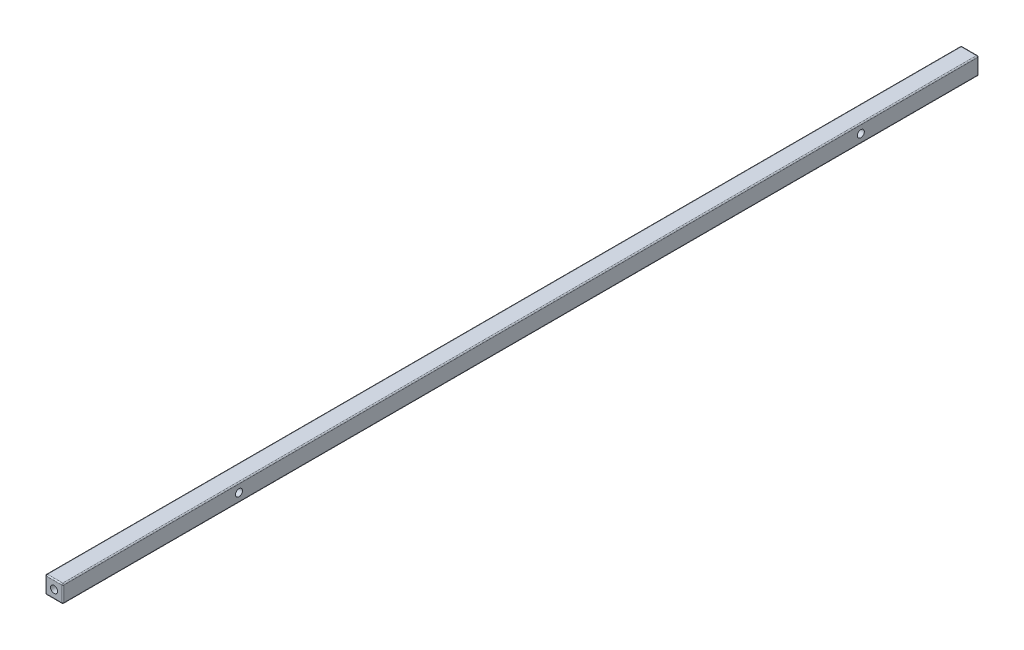
ISO-10303-21;
HEADER;
FILE_DESCRIPTION(('STEP AP214'),'2;1');
FILE_NAME('part.step','',(''),(''),'','','');
FILE_SCHEMA(('AUTOMOTIVE_DESIGN { 1 0 10303 214 1 1 1 1 }'));
ENDSEC;
DATA;
#1=APPLICATION_CONTEXT('core data for automotive mechanical design processes');
#2=APPLICATION_PROTOCOL_DEFINITION('international standard','automotive_design',2000,#1);
#3=PRODUCT_CONTEXT('',#1,'mechanical');
#4=PRODUCT('Part','Part','',(#3));
#5=PRODUCT_RELATED_PRODUCT_CATEGORY('part','',(#4));
#6=PRODUCT_DEFINITION_FORMATION('','',#4);
#7=PRODUCT_DEFINITION_CONTEXT('part definition',#1,'design');
#8=PRODUCT_DEFINITION('design','',#6,#7);
#9=PRODUCT_DEFINITION_SHAPE('','',#8);
#10=(LENGTH_UNIT() NAMED_UNIT(*) SI_UNIT(.MILLI.,.METRE.));
#11=(NAMED_UNIT(*) PLANE_ANGLE_UNIT() SI_UNIT($,.RADIAN.));
#12=(NAMED_UNIT(*) SI_UNIT($,.STERADIAN.) SOLID_ANGLE_UNIT());
#13=UNCERTAINTY_MEASURE_WITH_UNIT(LENGTH_MEASURE(1.E-05),#10,'distance_accuracy_value','');
#14=(GEOMETRIC_REPRESENTATION_CONTEXT(3) GLOBAL_UNCERTAINTY_ASSIGNED_CONTEXT((#13)) GLOBAL_UNIT_ASSIGNED_CONTEXT((#10,
#11,#12)) REPRESENTATION_CONTEXT('',''));
#15=CARTESIAN_POINT('',(0.,0.,0.));
#16=DIRECTION('',(0.,0.,1.));
#17=DIRECTION('',(1.,0.,0.));
#18=AXIS2_PLACEMENT_3D('',#15,#16,#17);
#19=CARTESIAN_POINT('',(15.,0.,785.));
#20=DIRECTION('',(-1.,0.,0.));
#21=DIRECTION('',(0.,0.,1.));
#22=AXIS2_PLACEMENT_3D('',#19,#20,#21);
#23=PLANE('',#22);
#24=CARTESIAN_POINT('',(15.,7.5,101.));
#25=DIRECTION('',(1.,0.,0.));
#26=DIRECTION('',(0.,0.,-1.));
#27=AXIS2_PLACEMENT_3D('',#24,#25,#26);
#28=CIRCLE('',#27,3.00000000000001);
#29=CARTESIAN_POINT('',(15.,7.5,98.));
#30=VERTEX_POINT('',#29);
#31=EDGE_CURVE('E488',#30,#30,#28,.T.);
#32=ORIENTED_EDGE('',*,*,#31,.F.);
#33=EDGE_LOOP('',(#32));
#34=FACE_BOUND('',#33,.T.);
#35=CARTESIAN_POINT('',(15.,7.5,634.));
#36=DIRECTION('',(1.,0.,0.));
#37=DIRECTION('',(0.,0.,-1.));
#38=AXIS2_PLACEMENT_3D('',#35,#36,#37);
#39=CIRCLE('',#38,3.00000000000005);
#40=CARTESIAN_POINT('',(15.,7.5,631.));
#41=VERTEX_POINT('',#40);
#42=EDGE_CURVE('E485',#41,#41,#39,.T.);
#43=ORIENTED_EDGE('',*,*,#42,.F.);
#44=EDGE_LOOP('',(#43));
#45=FACE_BOUND('',#44,.T.);
#46=DIRECTION('',(0.,0.,-1.));
#47=VECTOR('',#46,1.);
#48=CARTESIAN_POINT('',(15.,1.,785.));
#49=LINE('',#48,#47);
#50=CARTESIAN_POINT('',(15.,1.,784.));
#51=VERTEX_POINT('',#50);
#52=CARTESIAN_POINT('',(15.,1.,1.));
#53=VERTEX_POINT('',#52);
#54=EDGE_CURVE('E213',#51,#53,#49,.T.);
#55=ORIENTED_EDGE('',*,*,#54,.T.);
#56=DIRECTION('',(0.,1.,0.));
#57=VECTOR('',#56,1.);
#58=CARTESIAN_POINT('',(15.,0.,1.));
#59=LINE('',#58,#57);
#60=CARTESIAN_POINT('',(15.,14.,1.));
#61=VERTEX_POINT('',#60);
#62=EDGE_CURVE('E216',#53,#61,#59,.T.);
#63=ORIENTED_EDGE('',*,*,#62,.T.);
#64=DIRECTION('',(0.,0.,-1.));
#65=VECTOR('',#64,1.);
#66=CARTESIAN_POINT('',(15.,14.,785.));
#67=LINE('',#66,#65);
#68=CARTESIAN_POINT('',(15.,14.,784.));
#69=VERTEX_POINT('',#68);
#70=EDGE_CURVE('E210',#61,#69,#67,.F.);
#71=ORIENTED_EDGE('',*,*,#70,.T.);
#72=DIRECTION('',(0.,1.,0.));
#73=VECTOR('',#72,1.);
#74=CARTESIAN_POINT('',(15.,0.,784.));
#75=LINE('',#74,#73);
#76=EDGE_CURVE('E207',#69,#51,#75,.F.);
#77=ORIENTED_EDGE('',*,*,#76,.T.);
#78=EDGE_LOOP('',(#55,#63,#71,#77));
#79=FACE_BOUND('',#78,.T.);
#80=ADVANCED_FACE('F43',(#34,#45,#79),#23,.F.);
#81=CARTESIAN_POINT('',(15.,15.,785.));
#82=DIRECTION('',(0.,-1.,0.));
#83=DIRECTION('',(0.,0.,-1.));
#84=AXIS2_PLACEMENT_3D('',#81,#82,#83);
#85=PLANE('',#84);
#86=DIRECTION('',(0.,0.,-1.));
#87=VECTOR('',#86,1.);
#88=CARTESIAN_POINT('',(14.,15.,785.));
#89=LINE('',#88,#87);
#90=CARTESIAN_POINT('',(14.,15.,784.));
#91=VERTEX_POINT('',#90);
#92=CARTESIAN_POINT('',(14.,15.,1.));
#93=VERTEX_POINT('',#92);
#94=EDGE_CURVE('E226',#91,#93,#89,.T.);
#95=ORIENTED_EDGE('',*,*,#94,.T.);
#96=DIRECTION('',(-1.,0.,0.));
#97=VECTOR('',#96,1.);
#98=CARTESIAN_POINT('',(15.,15.,1.));
#99=LINE('',#98,#97);
#100=CARTESIAN_POINT('',(1.,15.,1.));
#101=VERTEX_POINT('',#100);
#102=EDGE_CURVE('E229',#93,#101,#99,.T.);
#103=ORIENTED_EDGE('',*,*,#102,.T.);
#104=DIRECTION('',(0.,0.,-1.));
#105=VECTOR('',#104,1.);
#106=CARTESIAN_POINT('',(1.,15.,785.));
#107=LINE('',#106,#105);
#108=CARTESIAN_POINT('',(1.,15.,784.));
#109=VERTEX_POINT('',#108);
#110=EDGE_CURVE('E220',#101,#109,#107,.F.);
#111=ORIENTED_EDGE('',*,*,#110,.T.);
#112=DIRECTION('',(-1.,0.,0.));
#113=VECTOR('',#112,1.);
#114=CARTESIAN_POINT('',(15.,15.,784.));
#115=LINE('',#114,#113);
#116=EDGE_CURVE('E223',#109,#91,#115,.F.);
#117=ORIENTED_EDGE('',*,*,#116,.T.);
#118=EDGE_LOOP('',(#95,#103,#111,#117));
#119=FACE_BOUND('',#118,.T.);
#120=ADVANCED_FACE('F356',(#119),#85,.F.);
#121=CARTESIAN_POINT('',(0.,15.,785.));
#122=DIRECTION('',(1.,0.,0.));
#123=DIRECTION('',(0.,0.,-1.));
#124=AXIS2_PLACEMENT_3D('',#121,#122,#123);
#125=PLANE('',#124);
#126=CARTESIAN_POINT('',(0.,7.5,101.));
#127=DIRECTION('',(1.,0.,0.));
#128=DIRECTION('',(0.,0.,-1.));
#129=AXIS2_PLACEMENT_3D('',#126,#127,#128);
#130=CIRCLE('',#129,3.00000000000001);
#131=CARTESIAN_POINT('',(0.,7.5,98.));
#132=VERTEX_POINT('',#131);
#133=EDGE_CURVE('E148',#132,#132,#130,.T.);
#134=ORIENTED_EDGE('',*,*,#133,.T.);
#135=EDGE_LOOP('',(#134));
#136=FACE_BOUND('',#135,.T.);
#137=CARTESIAN_POINT('',(0.,7.5,634.));
#138=DIRECTION('',(1.,0.,0.));
#139=DIRECTION('',(0.,0.,-1.));
#140=AXIS2_PLACEMENT_3D('',#137,#138,#139);
#141=CIRCLE('',#140,3.00000000000005);
#142=CARTESIAN_POINT('',(0.,7.5,631.));
#143=VERTEX_POINT('',#142);
#144=EDGE_CURVE('E482',#143,#143,#141,.T.);
#145=ORIENTED_EDGE('',*,*,#144,.T.);
#146=EDGE_LOOP('',(#145));
#147=FACE_BOUND('',#146,.T.);
#148=DIRECTION('',(0.,-1.,0.));
#149=VECTOR('',#148,1.);
#150=CARTESIAN_POINT('',(0.,15.,784.));
#151=LINE('',#150,#149);
#152=CARTESIAN_POINT('',(0.,1.,784.));
#153=VERTEX_POINT('',#152);
#154=CARTESIAN_POINT('',(0.,14.,784.));
#155=VERTEX_POINT('',#154);
#156=EDGE_CURVE('E169',#153,#155,#151,.F.);
#157=ORIENTED_EDGE('',*,*,#156,.T.);
#158=DIRECTION('',(0.,0.,-1.));
#159=VECTOR('',#158,1.);
#160=CARTESIAN_POINT('',(0.,14.,785.));
#161=LINE('',#160,#159);
#162=CARTESIAN_POINT('',(0.,14.,1.));
#163=VERTEX_POINT('',#162);
#164=EDGE_CURVE('E174',#155,#163,#161,.T.);
#165=ORIENTED_EDGE('',*,*,#164,.T.);
#166=DIRECTION('',(0.,-1.,0.));
#167=VECTOR('',#166,1.);
#168=CARTESIAN_POINT('',(0.,15.,1.));
#169=LINE('',#168,#167);
#170=CARTESIAN_POINT('',(0.,1.,1.));
#171=VERTEX_POINT('',#170);
#172=EDGE_CURVE('E141',#163,#171,#169,.T.);
#173=ORIENTED_EDGE('',*,*,#172,.T.);
#174=DIRECTION('',(0.,0.,-1.));
#175=VECTOR('',#174,1.);
#176=CARTESIAN_POINT('',(0.,1.,785.));
#177=LINE('',#176,#175);
#178=EDGE_CURVE('E162',#171,#153,#177,.F.);
#179=ORIENTED_EDGE('',*,*,#178,.T.);
#180=EDGE_LOOP('',(#157,#165,#173,#179));
#181=FACE_BOUND('',#180,.T.);
#182=ADVANCED_FACE('F172',(#136,#147,#181),#125,.F.);
#183=CARTESIAN_POINT('',(0.,0.,785.));
#184=DIRECTION('',(0.,1.,0.));
#185=DIRECTION('',(0.,0.,1.));
#186=AXIS2_PLACEMENT_3D('',#183,#184,#185);
#187=PLANE('',#186);
#188=DIRECTION('',(0.,0.,-1.));
#189=VECTOR('',#188,1.);
#190=CARTESIAN_POINT('',(1.,0.,785.));
#191=LINE('',#190,#189);
#192=CARTESIAN_POINT('',(1.,0.,784.));
#193=VERTEX_POINT('',#192);
#194=CARTESIAN_POINT('',(1.,0.,1.));
#195=VERTEX_POINT('',#194);
#196=EDGE_CURVE('E194',#193,#195,#191,.T.);
#197=ORIENTED_EDGE('',*,*,#196,.T.);
#198=DIRECTION('',(1.,0.,0.));
#199=VECTOR('',#198,1.);
#200=CARTESIAN_POINT('',(0.,0.,1.));
#201=LINE('',#200,#199);
#202=CARTESIAN_POINT('',(14.,0.,1.));
#203=VERTEX_POINT('',#202);
#204=EDGE_CURVE('E203',#195,#203,#201,.T.);
#205=ORIENTED_EDGE('',*,*,#204,.T.);
#206=DIRECTION('',(0.,0.,-1.));
#207=VECTOR('',#206,1.);
#208=CARTESIAN_POINT('',(14.,0.,785.));
#209=LINE('',#208,#207);
#210=CARTESIAN_POINT('',(14.,0.,784.));
#211=VERTEX_POINT('',#210);
#212=EDGE_CURVE('E200',#203,#211,#209,.F.);
#213=ORIENTED_EDGE('',*,*,#212,.T.);
#214=DIRECTION('',(1.,0.,0.));
#215=VECTOR('',#214,1.);
#216=CARTESIAN_POINT('',(0.,0.,784.));
#217=LINE('',#216,#215);
#218=EDGE_CURVE('E197',#211,#193,#217,.F.);
#219=ORIENTED_EDGE('',*,*,#218,.T.);
#220=EDGE_LOOP('',(#197,#205,#213,#219));
#221=FACE_BOUND('',#220,.T.);
#222=ADVANCED_FACE('F352',(#221),#187,.F.);
#223=CARTESIAN_POINT('',(0.,0.,785.));
#224=DIRECTION('',(0.,0.,1.));
#225=DIRECTION('',(1.,0.,0.));
#226=AXIS2_PLACEMENT_3D('',#223,#224,#225);
#227=PLANE('',#226);
#228=DIRECTION('',(0.,-1.,0.));
#229=VECTOR('',#228,1.);
#230=CARTESIAN_POINT('',(1.,0.,785.));
#231=LINE('',#230,#229);
#232=CARTESIAN_POINT('',(1.,14.,785.));
#233=VERTEX_POINT('',#232);
#234=CARTESIAN_POINT('',(1.,1.,785.));
#235=VERTEX_POINT('',#234);
#236=EDGE_CURVE('E233',#233,#235,#231,.T.);
#237=ORIENTED_EDGE('',*,*,#236,.T.);
#238=DIRECTION('',(1.,0.,0.));
#239=VECTOR('',#238,1.);
#240=CARTESIAN_POINT('',(15.,1.,785.));
#241=LINE('',#240,#239);
#242=CARTESIAN_POINT('',(14.,1.,785.));
#243=VERTEX_POINT('',#242);
#244=EDGE_CURVE('E11',#235,#243,#241,.T.);
#245=ORIENTED_EDGE('',*,*,#244,.T.);
#246=DIRECTION('',(0.,1.,0.));
#247=VECTOR('',#246,1.);
#248=CARTESIAN_POINT('',(14.,15.,785.));
#249=LINE('',#248,#247);
#250=CARTESIAN_POINT('',(14.,14.,785.));
#251=VERTEX_POINT('',#250);
#252=EDGE_CURVE('E53',#243,#251,#249,.T.);
#253=ORIENTED_EDGE('',*,*,#252,.T.);
#254=DIRECTION('',(-1.,0.,0.));
#255=VECTOR('',#254,1.);
#256=CARTESIAN_POINT('',(0.,14.,785.));
#257=LINE('',#256,#255);
#258=EDGE_CURVE('E236',#251,#233,#257,.T.);
#259=ORIENTED_EDGE('',*,*,#258,.T.);
#260=EDGE_LOOP('',(#237,#245,#253,#259));
#261=FACE_BOUND('',#260,.T.);
#262=CARTESIAN_POINT('',(7.5,7.5,785.));
#263=DIRECTION('',(0.,0.,1.));
#264=DIRECTION('',(1.,0.,0.));
#265=AXIS2_PLACEMENT_3D('',#262,#263,#264);
#266=CIRCLE('',#265,3.);
#267=CARTESIAN_POINT('',(10.5,7.5,785.));
#268=VERTEX_POINT('',#267);
#269=EDGE_CURVE('E315',#268,#268,#266,.T.);
#270=ORIENTED_EDGE('',*,*,#269,.F.);
#271=EDGE_LOOP('',(#270));
#272=FACE_BOUND('',#271,.T.);
#273=ADVANCED_FACE('F342',(#261,#272),#227,.T.);
#274=CARTESIAN_POINT('',(0.,0.,0.));
#275=DIRECTION('',(0.,0.,1.));
#276=DIRECTION('',(1.,0.,0.));
#277=AXIS2_PLACEMENT_3D('',#274,#275,#276);
#278=PLANE('',#277);
#279=DIRECTION('',(1.,0.,0.));
#280=VECTOR('',#279,1.);
#281=CARTESIAN_POINT('',(0.,1.,0.));
#282=LINE('',#281,#280);
#283=CARTESIAN_POINT('',(14.,1.,0.));
#284=VERTEX_POINT('',#283);
#285=CARTESIAN_POINT('',(1.,1.,0.));
#286=VERTEX_POINT('',#285);
#287=EDGE_CURVE('E189',#284,#286,#282,.F.);
#288=ORIENTED_EDGE('',*,*,#287,.T.);
#289=DIRECTION('',(0.,-1.,0.));
#290=VECTOR('',#289,1.);
#291=CARTESIAN_POINT('',(1.,0.,0.));
#292=LINE('',#291,#290);
#293=CARTESIAN_POINT('',(1.,14.,0.));
#294=VERTEX_POINT('',#293);
#295=EDGE_CURVE('E143',#286,#294,#292,.F.);
#296=ORIENTED_EDGE('',*,*,#295,.T.);
#297=DIRECTION('',(-1.,0.,0.));
#298=VECTOR('',#297,1.);
#299=CARTESIAN_POINT('',(0.,14.,0.));
#300=LINE('',#299,#298);
#301=CARTESIAN_POINT('',(14.,14.,0.));
#302=VERTEX_POINT('',#301);
#303=EDGE_CURVE('E180',#294,#302,#300,.F.);
#304=ORIENTED_EDGE('',*,*,#303,.T.);
#305=DIRECTION('',(0.,1.,0.));
#306=VECTOR('',#305,1.);
#307=CARTESIAN_POINT('',(14.,0.,0.));
#308=LINE('',#307,#306);
#309=EDGE_CURVE('E186',#302,#284,#308,.F.);
#310=ORIENTED_EDGE('',*,*,#309,.T.);
#311=EDGE_LOOP('',(#288,#296,#304,#310));
#312=FACE_BOUND('',#311,.T.);
#313=CARTESIAN_POINT('',(7.5,7.5,0.));
#314=DIRECTION('',(0.,0.,-1.));
#315=DIRECTION('',(-1.,0.,0.));
#316=AXIS2_PLACEMENT_3D('',#313,#314,#315);
#317=CIRCLE('',#316,3.);
#318=CARTESIAN_POINT('',(4.5,7.5,0.));
#319=VERTEX_POINT('',#318);
#320=EDGE_CURVE('E327',#319,#319,#317,.T.);
#321=ORIENTED_EDGE('',*,*,#320,.F.);
#322=EDGE_LOOP('',(#321));
#323=FACE_BOUND('',#322,.T.);
#324=ADVANCED_FACE('F340',(#312,#323),#278,.F.);
#325=CARTESIAN_POINT('',(7.5,7.5,5.));
#326=DIRECTION('',(0.,0.,-1.));
#327=DIRECTION('',(-1.,0.,0.));
#328=AXIS2_PLACEMENT_3D('',#325,#326,#327);
#329=CYLINDRICAL_SURFACE('',#328,3.);
#330=CARTESIAN_POINT('',(7.5,7.5,5.));
#331=DIRECTION('',(0.,0.,-1.));
#332=DIRECTION('',(-1.,0.,0.));
#333=AXIS2_PLACEMENT_3D('',#330,#331,#332);
#334=CIRCLE('',#333,3.);
#335=CARTESIAN_POINT('',(4.5,7.5,5.));
#336=VERTEX_POINT('',#335);
#337=EDGE_CURVE('E170',#336,#336,#334,.T.);
#338=ORIENTED_EDGE('',*,*,#337,.F.);
#339=EDGE_LOOP('',(#338));
#340=FACE_BOUND('',#339,.T.);
#341=ORIENTED_EDGE('',*,*,#320,.T.);
#342=EDGE_LOOP('',(#341));
#343=FACE_BOUND('',#342,.T.);
#344=ADVANCED_FACE('F338',(#340,#343),#329,.F.);
#345=CARTESIAN_POINT('',(7.5,7.5,5.));
#346=DIRECTION('',(0.,0.,-1.));
#347=DIRECTION('',(-1.,0.,0.));
#348=AXIS2_PLACEMENT_3D('',#345,#346,#347);
#349=PLANE('',#348);
#350=ORIENTED_EDGE('',*,*,#337,.T.);
#351=EDGE_LOOP('',(#350));
#352=FACE_BOUND('',#351,.T.);
#353=ADVANCED_FACE('F349',(#352),#349,.T.);
#354=CARTESIAN_POINT('',(7.5,7.5,780.));
#355=DIRECTION('',(0.,0.,1.));
#356=DIRECTION('',(1.,0.,0.));
#357=AXIS2_PLACEMENT_3D('',#354,#355,#356);
#358=CYLINDRICAL_SURFACE('',#357,3.);
#359=CARTESIAN_POINT('',(7.5,7.5,780.));
#360=DIRECTION('',(0.,0.,1.));
#361=DIRECTION('',(1.,0.,0.));
#362=AXIS2_PLACEMENT_3D('',#359,#360,#361);
#363=CIRCLE('',#362,3.);
#364=CARTESIAN_POINT('',(10.5,7.5,780.));
#365=VERTEX_POINT('',#364);
#366=EDGE_CURVE('E321',#365,#365,#363,.T.);
#367=ORIENTED_EDGE('',*,*,#366,.F.);
#368=EDGE_LOOP('',(#367));
#369=FACE_BOUND('',#368,.T.);
#370=ORIENTED_EDGE('',*,*,#269,.T.);
#371=EDGE_LOOP('',(#370));
#372=FACE_BOUND('',#371,.T.);
#373=ADVANCED_FACE('F507',(#369,#372),#358,.F.);
#374=CARTESIAN_POINT('',(7.5,7.5,780.));
#375=DIRECTION('',(0.,0.,1.));
#376=DIRECTION('',(1.,0.,0.));
#377=AXIS2_PLACEMENT_3D('',#374,#375,#376);
#378=PLANE('',#377);
#379=ORIENTED_EDGE('',*,*,#366,.T.);
#380=EDGE_LOOP('',(#379));
#381=FACE_BOUND('',#380,.T.);
#382=ADVANCED_FACE('F437',(#381),#378,.T.);
#383=CARTESIAN_POINT('',(14.,0.,784.));
#384=DIRECTION('',(0.,-1.,0.));
#385=DIRECTION('',(0.,0.,-1.));
#386=AXIS2_PLACEMENT_3D('',#383,#384,#385);
#387=CYLINDRICAL_SURFACE('',#386,1.);
#388=CARTESIAN_POINT('',(14.,14.,784.));
#389=DIRECTION('',(0.,1.,0.));
#390=DIRECTION('',(0.,0.,1.));
#391=AXIS2_PLACEMENT_3D('',#388,#389,#390);
#392=CIRCLE('',#391,1.);
#393=EDGE_CURVE('E47',#251,#69,#392,.T.);
#394=ORIENTED_EDGE('',*,*,#393,.F.);
#395=ORIENTED_EDGE('',*,*,#252,.F.);
#396=CARTESIAN_POINT('',(14.,1.,784.));
#397=DIRECTION('',(0.,-1.,0.));
#398=DIRECTION('',(0.,0.,-1.));
#399=AXIS2_PLACEMENT_3D('',#396,#397,#398);
#400=CIRCLE('',#399,1.);
#401=EDGE_CURVE('E308',#51,#243,#400,.T.);
#402=ORIENTED_EDGE('',*,*,#401,.F.);
#403=ORIENTED_EDGE('',*,*,#76,.F.);
#404=EDGE_LOOP('',(#394,#395,#402,#403));
#405=FACE_BOUND('',#404,.T.);
#406=ADVANCED_FACE('F45',(#405),#387,.T.);
#407=CARTESIAN_POINT('',(14.,14.,784.));
#408=DIRECTION('',(1.,0.,0.));
#409=DIRECTION('',(0.,0.,-1.));
#410=AXIS2_PLACEMENT_3D('',#407,#408,#409);
#411=SPHERICAL_SURFACE('',#410,1.);
#412=CARTESIAN_POINT('',(14.,14.,784.));
#413=DIRECTION('',(1.,0.,0.));
#414=DIRECTION('',(0.,0.,-1.));
#415=AXIS2_PLACEMENT_3D('',#412,#413,#414);
#416=CIRCLE('',#415,1.);
#417=EDGE_CURVE('E301',#251,#91,#416,.F.);
#418=ORIENTED_EDGE('',*,*,#417,.F.);
#419=ORIENTED_EDGE('',*,*,#393,.T.);
#420=CARTESIAN_POINT('',(14.,14.,784.));
#421=DIRECTION('',(0.,0.,1.));
#422=DIRECTION('',(1.,0.,0.));
#423=AXIS2_PLACEMENT_3D('',#420,#421,#422);
#424=CIRCLE('',#423,1.);
#425=EDGE_CURVE('E305',#91,#69,#424,.F.);
#426=ORIENTED_EDGE('',*,*,#425,.F.);
#427=EDGE_LOOP('',(#418,#419,#426));
#428=FACE_BOUND('',#427,.T.);
#429=ADVANCED_FACE('F432',(#428),#411,.T.);
#430=CARTESIAN_POINT('',(14.,1.,784.));
#431=DIRECTION('',(0.,0.,1.));
#432=DIRECTION('',(1.,0.,0.));
#433=AXIS2_PLACEMENT_3D('',#430,#431,#432);
#434=SPHERICAL_SURFACE('',#433,1.);
#435=CARTESIAN_POINT('',(14.,1.,784.));
#436=DIRECTION('',(0.,0.,1.));
#437=DIRECTION('',(1.,0.,0.));
#438=AXIS2_PLACEMENT_3D('',#435,#436,#437);
#439=CIRCLE('',#438,1.);
#440=EDGE_CURVE('E295',#51,#211,#439,.F.);
#441=ORIENTED_EDGE('',*,*,#440,.F.);
#442=ORIENTED_EDGE('',*,*,#401,.T.);
#443=CARTESIAN_POINT('',(14.,1.,784.));
#444=DIRECTION('',(1.,0.,0.));
#445=DIRECTION('',(0.,0.,-1.));
#446=AXIS2_PLACEMENT_3D('',#443,#444,#445);
#447=CIRCLE('',#446,1.);
#448=EDGE_CURVE('E61',#211,#243,#447,.F.);
#449=ORIENTED_EDGE('',*,*,#448,.F.);
#450=EDGE_LOOP('',(#441,#442,#449));
#451=FACE_BOUND('',#450,.T.);
#452=ADVANCED_FACE('F429',(#451),#434,.T.);
#453=CARTESIAN_POINT('',(14.,14.,785.));
#454=DIRECTION('',(0.,0.,-1.));
#455=DIRECTION('',(-1.,0.,0.));
#456=AXIS2_PLACEMENT_3D('',#453,#454,#455);
#457=CYLINDRICAL_SURFACE('',#456,1.);
#458=ORIENTED_EDGE('',*,*,#425,.T.);
#459=ORIENTED_EDGE('',*,*,#70,.F.);
#460=CARTESIAN_POINT('',(14.,14.,1.));
#461=DIRECTION('',(0.,0.,-1.));
#462=DIRECTION('',(-1.,0.,0.));
#463=AXIS2_PLACEMENT_3D('',#460,#461,#462);
#464=CIRCLE('',#463,1.);
#465=EDGE_CURVE('E288',#93,#61,#464,.T.);
#466=ORIENTED_EDGE('',*,*,#465,.F.);
#467=ORIENTED_EDGE('',*,*,#94,.F.);
#468=EDGE_LOOP('',(#458,#459,#466,#467));
#469=FACE_BOUND('',#468,.T.);
#470=ADVANCED_FACE('F425',(#469),#457,.T.);
#471=CARTESIAN_POINT('',(0.,14.,784.));
#472=DIRECTION('',(1.,0.,0.));
#473=DIRECTION('',(0.,0.,-1.));
#474=AXIS2_PLACEMENT_3D('',#471,#472,#473);
#475=CYLINDRICAL_SURFACE('',#474,1.);
#476=ORIENTED_EDGE('',*,*,#417,.T.);
#477=ORIENTED_EDGE('',*,*,#116,.F.);
#478=CARTESIAN_POINT('',(1.,14.,784.));
#479=DIRECTION('',(-1.,0.,0.));
#480=DIRECTION('',(0.,0.,1.));
#481=AXIS2_PLACEMENT_3D('',#478,#479,#480);
#482=CIRCLE('',#481,1.);
#483=EDGE_CURVE('E284',#233,#109,#482,.T.);
#484=ORIENTED_EDGE('',*,*,#483,.F.);
#485=ORIENTED_EDGE('',*,*,#258,.F.);
#486=EDGE_LOOP('',(#476,#477,#484,#485));
#487=FACE_BOUND('',#486,.T.);
#488=ADVANCED_FACE('F421',(#487),#475,.T.);
#489=CARTESIAN_POINT('',(1.,0.,784.));
#490=DIRECTION('',(0.,1.,0.));
#491=DIRECTION('',(0.,0.,1.));
#492=AXIS2_PLACEMENT_3D('',#489,#490,#491);
#493=CYLINDRICAL_SURFACE('',#492,1.);
#494=CARTESIAN_POINT('',(1.,1.,784.));
#495=DIRECTION('',(0.,-1.,0.));
#496=DIRECTION('',(0.,0.,-1.));
#497=AXIS2_PLACEMENT_3D('',#494,#495,#496);
#498=CIRCLE('',#497,1.);
#499=EDGE_CURVE('E276',#235,#153,#498,.T.);
#500=ORIENTED_EDGE('',*,*,#499,.F.);
#501=ORIENTED_EDGE('',*,*,#236,.F.);
#502=CARTESIAN_POINT('',(1.,14.,784.));
#503=DIRECTION('',(0.,1.,0.));
#504=DIRECTION('',(0.,0.,1.));
#505=AXIS2_PLACEMENT_3D('',#502,#503,#504);
#506=CIRCLE('',#505,1.);
#507=EDGE_CURVE('E280',#155,#233,#506,.T.);
#508=ORIENTED_EDGE('',*,*,#507,.F.);
#509=ORIENTED_EDGE('',*,*,#156,.F.);
#510=EDGE_LOOP('',(#500,#501,#508,#509));
#511=FACE_BOUND('',#510,.T.);
#512=ADVANCED_FACE('F418',(#511),#493,.T.);
#513=CARTESIAN_POINT('',(0.,1.,784.));
#514=DIRECTION('',(-1.,0.,0.));
#515=DIRECTION('',(0.,0.,1.));
#516=AXIS2_PLACEMENT_3D('',#513,#514,#515);
#517=CYLINDRICAL_SURFACE('',#516,1.);
#518=ORIENTED_EDGE('',*,*,#448,.T.);
#519=ORIENTED_EDGE('',*,*,#244,.F.);
#520=CARTESIAN_POINT('',(1.,1.,784.));
#521=DIRECTION('',(-1.,0.,0.));
#522=DIRECTION('',(0.,0.,1.));
#523=AXIS2_PLACEMENT_3D('',#520,#521,#522);
#524=CIRCLE('',#523,1.);
#525=EDGE_CURVE('E272',#193,#235,#524,.T.);
#526=ORIENTED_EDGE('',*,*,#525,.F.);
#527=ORIENTED_EDGE('',*,*,#218,.F.);
#528=EDGE_LOOP('',(#518,#519,#526,#527));
#529=FACE_BOUND('',#528,.T.);
#530=ADVANCED_FACE('F414',(#529),#517,.T.);
#531=CARTESIAN_POINT('',(14.,1.,785.));
#532=DIRECTION('',(0.,0.,-1.));
#533=DIRECTION('',(-1.,0.,0.));
#534=AXIS2_PLACEMENT_3D('',#531,#532,#533);
#535=CYLINDRICAL_SURFACE('',#534,1.);
#536=ORIENTED_EDGE('',*,*,#440,.T.);
#537=ORIENTED_EDGE('',*,*,#212,.F.);
#538=CARTESIAN_POINT('',(14.,1.,1.));
#539=DIRECTION('',(0.,0.,-1.));
#540=DIRECTION('',(-1.,0.,0.));
#541=AXIS2_PLACEMENT_3D('',#538,#539,#540);
#542=CIRCLE('',#541,1.);
#543=EDGE_CURVE('E268',#53,#203,#542,.T.);
#544=ORIENTED_EDGE('',*,*,#543,.F.);
#545=ORIENTED_EDGE('',*,*,#54,.F.);
#546=EDGE_LOOP('',(#536,#537,#544,#545));
#547=FACE_BOUND('',#546,.T.);
#548=ADVANCED_FACE('F410',(#547),#535,.T.);
#549=CARTESIAN_POINT('',(14.,0.,1.));
#550=DIRECTION('',(0.,1.,0.));
#551=DIRECTION('',(0.,0.,1.));
#552=AXIS2_PLACEMENT_3D('',#549,#550,#551);
#553=CYLINDRICAL_SURFACE('',#552,1.);
#554=CARTESIAN_POINT('',(14.,14.,1.));
#555=DIRECTION('',(0.,1.,0.));
#556=DIRECTION('',(0.,0.,1.));
#557=AXIS2_PLACEMENT_3D('',#554,#555,#556);
#558=CIRCLE('',#557,1.);
#559=EDGE_CURVE('E291',#61,#302,#558,.T.);
#560=ORIENTED_EDGE('',*,*,#559,.F.);
#561=ORIENTED_EDGE('',*,*,#62,.F.);
#562=CARTESIAN_POINT('',(14.,1.,1.));
#563=DIRECTION('',(0.,-1.,0.));
#564=DIRECTION('',(0.,0.,-1.));
#565=AXIS2_PLACEMENT_3D('',#562,#563,#564);
#566=CIRCLE('',#565,1.);
#567=EDGE_CURVE('E264',#284,#53,#566,.T.);
#568=ORIENTED_EDGE('',*,*,#567,.F.);
#569=ORIENTED_EDGE('',*,*,#309,.F.);
#570=EDGE_LOOP('',(#560,#561,#568,#569));
#571=FACE_BOUND('',#570,.T.);
#572=ADVANCED_FACE('F406',(#571),#553,.T.);
#573=CARTESIAN_POINT('',(14.,14.,1.));
#574=DIRECTION('',(1.,0.,0.));
#575=DIRECTION('',(0.,0.,-1.));
#576=AXIS2_PLACEMENT_3D('',#573,#574,#575);
#577=SPHERICAL_SURFACE('',#576,1.);
#578=ORIENTED_EDGE('',*,*,#465,.T.);
#579=ORIENTED_EDGE('',*,*,#559,.T.);
#580=CARTESIAN_POINT('',(14.,14.,1.));
#581=DIRECTION('',(1.,0.,0.));
#582=DIRECTION('',(0.,0.,-1.));
#583=AXIS2_PLACEMENT_3D('',#580,#581,#582);
#584=CIRCLE('',#583,1.);
#585=EDGE_CURVE('E260',#93,#302,#584,.F.);
#586=ORIENTED_EDGE('',*,*,#585,.F.);
#587=EDGE_LOOP('',(#578,#579,#586));
#588=FACE_BOUND('',#587,.T.);
#589=ADVANCED_FACE('F402',(#588),#577,.T.);
#590=CARTESIAN_POINT('',(1.,14.,784.));
#591=DIRECTION('',(0.,0.,1.));
#592=DIRECTION('',(1.,0.,0.));
#593=AXIS2_PLACEMENT_3D('',#590,#591,#592);
#594=SPHERICAL_SURFACE('',#593,1.);
#595=ORIENTED_EDGE('',*,*,#507,.T.);
#596=ORIENTED_EDGE('',*,*,#483,.T.);
#597=CARTESIAN_POINT('',(1.,14.,784.));
#598=DIRECTION('',(0.,0.,1.));
#599=DIRECTION('',(1.,0.,0.));
#600=AXIS2_PLACEMENT_3D('',#597,#598,#599);
#601=CIRCLE('',#600,1.);
#602=EDGE_CURVE('E256',#155,#109,#601,.F.);
#603=ORIENTED_EDGE('',*,*,#602,.F.);
#604=EDGE_LOOP('',(#595,#596,#603));
#605=FACE_BOUND('',#604,.T.);
#606=ADVANCED_FACE('F398',(#605),#594,.T.);
#607=CARTESIAN_POINT('',(1.,1.,784.));
#608=DIRECTION('',(0.,0.,1.));
#609=DIRECTION('',(1.,0.,0.));
#610=AXIS2_PLACEMENT_3D('',#607,#608,#609);
#611=SPHERICAL_SURFACE('',#610,1.);
#612=ORIENTED_EDGE('',*,*,#525,.T.);
#613=ORIENTED_EDGE('',*,*,#499,.T.);
#614=CARTESIAN_POINT('',(1.,1.,784.));
#615=DIRECTION('',(0.,0.,1.));
#616=DIRECTION('',(1.,0.,0.));
#617=AXIS2_PLACEMENT_3D('',#614,#615,#616);
#618=CIRCLE('',#617,1.);
#619=EDGE_CURVE('E165',#193,#153,#618,.F.);
#620=ORIENTED_EDGE('',*,*,#619,.F.);
#621=EDGE_LOOP('',(#612,#613,#620));
#622=FACE_BOUND('',#621,.T.);
#623=ADVANCED_FACE('F394',(#622),#611,.T.);
#624=CARTESIAN_POINT('',(14.,1.,1.));
#625=DIRECTION('',(1.,0.,0.));
#626=DIRECTION('',(0.,0.,-1.));
#627=AXIS2_PLACEMENT_3D('',#624,#625,#626);
#628=SPHERICAL_SURFACE('',#627,1.);
#629=ORIENTED_EDGE('',*,*,#567,.T.);
#630=ORIENTED_EDGE('',*,*,#543,.T.);
#631=CARTESIAN_POINT('',(14.,1.,1.));
#632=DIRECTION('',(1.,0.,0.));
#633=DIRECTION('',(0.,0.,-1.));
#634=AXIS2_PLACEMENT_3D('',#631,#632,#633);
#635=CIRCLE('',#634,1.);
#636=EDGE_CURVE('E251',#284,#203,#635,.F.);
#637=ORIENTED_EDGE('',*,*,#636,.F.);
#638=EDGE_LOOP('',(#629,#630,#637));
#639=FACE_BOUND('',#638,.T.);
#640=ADVANCED_FACE('F390',(#639),#628,.T.);
#641=CARTESIAN_POINT('',(15.,14.,1.));
#642=DIRECTION('',(-1.,0.,0.));
#643=DIRECTION('',(0.,0.,1.));
#644=AXIS2_PLACEMENT_3D('',#641,#642,#643);
#645=CYLINDRICAL_SURFACE('',#644,1.);
#646=ORIENTED_EDGE('',*,*,#585,.T.);
#647=ORIENTED_EDGE('',*,*,#303,.F.);
#648=CARTESIAN_POINT('',(1.,14.,1.));
#649=DIRECTION('',(-1.,0.,0.));
#650=DIRECTION('',(0.,0.,1.));
#651=AXIS2_PLACEMENT_3D('',#648,#649,#650);
#652=CIRCLE('',#651,1.);
#653=EDGE_CURVE('E247',#101,#294,#652,.T.);
#654=ORIENTED_EDGE('',*,*,#653,.F.);
#655=ORIENTED_EDGE('',*,*,#102,.F.);
#656=EDGE_LOOP('',(#646,#647,#654,#655));
#657=FACE_BOUND('',#656,.T.);
#658=ADVANCED_FACE('F386',(#657),#645,.T.);
#659=CARTESIAN_POINT('',(1.,14.,785.));
#660=DIRECTION('',(0.,0.,-1.));
#661=DIRECTION('',(-1.,0.,0.));
#662=AXIS2_PLACEMENT_3D('',#659,#660,#661);
#663=CYLINDRICAL_SURFACE('',#662,1.);
#664=ORIENTED_EDGE('',*,*,#602,.T.);
#665=ORIENTED_EDGE('',*,*,#110,.F.);
#666=CARTESIAN_POINT('',(1.,14.,1.));
#667=DIRECTION('',(0.,0.,-1.));
#668=DIRECTION('',(-1.,0.,0.));
#669=AXIS2_PLACEMENT_3D('',#666,#667,#668);
#670=CIRCLE('',#669,1.);
#671=EDGE_CURVE('E159',#163,#101,#670,.T.);
#672=ORIENTED_EDGE('',*,*,#671,.F.);
#673=ORIENTED_EDGE('',*,*,#164,.F.);
#674=EDGE_LOOP('',(#664,#665,#672,#673));
#675=FACE_BOUND('',#674,.T.);
#676=ADVANCED_FACE('F383',(#675),#663,.T.);
#677=CARTESIAN_POINT('',(1.,1.,785.));
#678=DIRECTION('',(0.,0.,-1.));
#679=DIRECTION('',(-1.,0.,0.));
#680=AXIS2_PLACEMENT_3D('',#677,#678,#679);
#681=CYLINDRICAL_SURFACE('',#680,1.);
#682=ORIENTED_EDGE('',*,*,#619,.T.);
#683=ORIENTED_EDGE('',*,*,#178,.F.);
#684=CARTESIAN_POINT('',(1.,1.,1.));
#685=DIRECTION('',(0.,0.,-1.));
#686=DIRECTION('',(-1.,0.,0.));
#687=AXIS2_PLACEMENT_3D('',#684,#685,#686);
#688=CIRCLE('',#687,1.);
#689=EDGE_CURVE('E151',#195,#171,#688,.T.);
#690=ORIENTED_EDGE('',*,*,#689,.F.);
#691=ORIENTED_EDGE('',*,*,#196,.F.);
#692=EDGE_LOOP('',(#682,#683,#690,#691));
#693=FACE_BOUND('',#692,.T.);
#694=ADVANCED_FACE('F163',(#693),#681,.T.);
#695=CARTESIAN_POINT('',(0.,1.,1.));
#696=DIRECTION('',(1.,0.,0.));
#697=DIRECTION('',(0.,0.,-1.));
#698=AXIS2_PLACEMENT_3D('',#695,#696,#697);
#699=CYLINDRICAL_SURFACE('',#698,1.);
#700=ORIENTED_EDGE('',*,*,#636,.T.);
#701=ORIENTED_EDGE('',*,*,#204,.F.);
#702=CARTESIAN_POINT('',(1.,1.,1.));
#703=DIRECTION('',(-1.,0.,0.));
#704=DIRECTION('',(0.,0.,1.));
#705=AXIS2_PLACEMENT_3D('',#702,#703,#704);
#706=CIRCLE('',#705,1.);
#707=EDGE_CURVE('E155',#286,#195,#706,.T.);
#708=ORIENTED_EDGE('',*,*,#707,.F.);
#709=ORIENTED_EDGE('',*,*,#287,.F.);
#710=EDGE_LOOP('',(#700,#701,#708,#709));
#711=FACE_BOUND('',#710,.T.);
#712=ADVANCED_FACE('F376',(#711),#699,.T.);
#713=CARTESIAN_POINT('',(1.,14.,1.));
#714=DIRECTION('',(0.,1.,0.));
#715=DIRECTION('',(0.,0.,1.));
#716=AXIS2_PLACEMENT_3D('',#713,#714,#715);
#717=SPHERICAL_SURFACE('',#716,1.);
#718=ORIENTED_EDGE('',*,*,#671,.T.);
#719=ORIENTED_EDGE('',*,*,#653,.T.);
#720=CARTESIAN_POINT('',(1.,14.,1.));
#721=DIRECTION('',(0.,1.,0.));
#722=DIRECTION('',(0.,0.,1.));
#723=AXIS2_PLACEMENT_3D('',#720,#721,#722);
#724=CIRCLE('',#723,1.);
#725=EDGE_CURVE('E147',#163,#294,#724,.F.);
#726=ORIENTED_EDGE('',*,*,#725,.F.);
#727=EDGE_LOOP('',(#718,#719,#726));
#728=FACE_BOUND('',#727,.T.);
#729=ADVANCED_FACE('F373',(#728),#717,.T.);
#730=CARTESIAN_POINT('',(1.,1.,1.));
#731=DIRECTION('',(0.,-1.,0.));
#732=DIRECTION('',(0.,0.,-1.));
#733=AXIS2_PLACEMENT_3D('',#730,#731,#732);
#734=SPHERICAL_SURFACE('',#733,1.);
#735=ORIENTED_EDGE('',*,*,#707,.T.);
#736=ORIENTED_EDGE('',*,*,#689,.T.);
#737=CARTESIAN_POINT('',(1.,1.,1.));
#738=DIRECTION('',(0.,-1.,0.));
#739=DIRECTION('',(0.,0.,-1.));
#740=AXIS2_PLACEMENT_3D('',#737,#738,#739);
#741=CIRCLE('',#740,1.);
#742=EDGE_CURVE('E137',#286,#171,#741,.F.);
#743=ORIENTED_EDGE('',*,*,#742,.F.);
#744=EDGE_LOOP('',(#735,#736,#743));
#745=FACE_BOUND('',#744,.T.);
#746=ADVANCED_FACE('F153',(#745),#734,.T.);
#747=CARTESIAN_POINT('',(1.,15.,1.));
#748=DIRECTION('',(0.,-1.,0.));
#749=DIRECTION('',(0.,0.,-1.));
#750=AXIS2_PLACEMENT_3D('',#747,#748,#749);
#751=CYLINDRICAL_SURFACE('',#750,1.);
#752=ORIENTED_EDGE('',*,*,#725,.T.);
#753=ORIENTED_EDGE('',*,*,#295,.F.);
#754=ORIENTED_EDGE('',*,*,#742,.T.);
#755=ORIENTED_EDGE('',*,*,#172,.F.);
#756=EDGE_LOOP('',(#752,#753,#754,#755));
#757=FACE_BOUND('',#756,.T.);
#758=ADVANCED_FACE('F139',(#757),#751,.T.);
#759=CARTESIAN_POINT('',(0.,7.5,634.));
#760=DIRECTION('',(1.,0.,0.));
#761=DIRECTION('',(0.,0.,-1.));
#762=AXIS2_PLACEMENT_3D('',#759,#760,#761);
#763=CYLINDRICAL_SURFACE('',#762,3.00000000000005);
#764=ORIENTED_EDGE('',*,*,#144,.F.);
#765=EDGE_LOOP('',(#764));
#766=FACE_BOUND('',#765,.T.);
#767=ORIENTED_EDGE('',*,*,#42,.T.);
#768=EDGE_LOOP('',(#767));
#769=FACE_BOUND('',#768,.T.);
#770=ADVANCED_FACE('F370',(#766,#769),#763,.F.);
#771=CARTESIAN_POINT('',(0.,7.5,101.));
#772=DIRECTION('',(1.,0.,0.));
#773=DIRECTION('',(0.,0.,-1.));
#774=AXIS2_PLACEMENT_3D('',#771,#772,#773);
#775=CYLINDRICAL_SURFACE('',#774,3.00000000000001);
#776=ORIENTED_EDGE('',*,*,#133,.F.);
#777=EDGE_LOOP('',(#776));
#778=FACE_BOUND('',#777,.T.);
#779=ORIENTED_EDGE('',*,*,#31,.T.);
#780=EDGE_LOOP('',(#779));
#781=FACE_BOUND('',#780,.T.);
#782=ADVANCED_FACE('F496',(#778,#781),#775,.F.);
#783=CLOSED_SHELL('',(#80,#120,#182,#222,#273,#324,#344,#353,#373,#382,#406,#429,#452,#470,#488,
#512,#530,#548,#572,#589,#606,#623,#640,#658,#676,#694,#712,#729,#746,#758,#770,#782));
#784=MANIFOLD_SOLID_BREP('B2',#783);
#785=ADVANCED_BREP_SHAPE_REPRESENTATION('',(#18,#784),#14);
#786=SHAPE_DEFINITION_REPRESENTATION(#9,#785);
ENDSEC;
END-ISO-10303-21;
